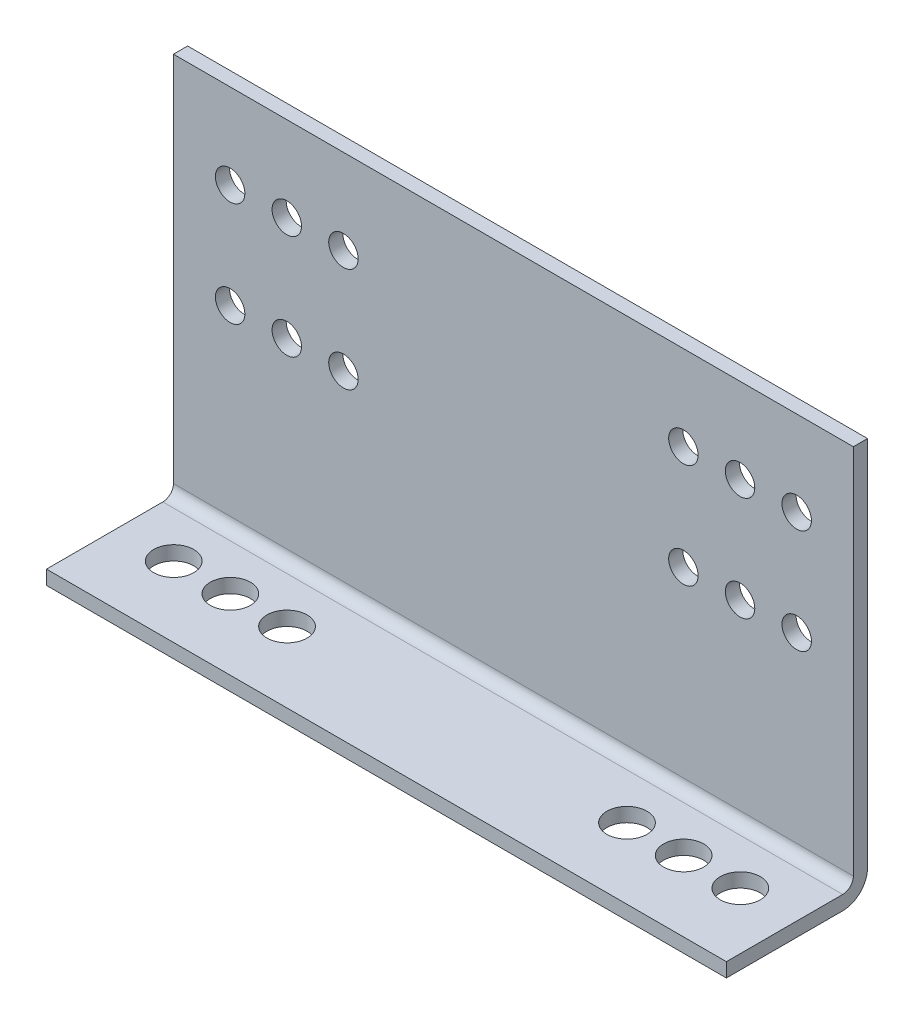
ISO-10303-21;
HEADER;
FILE_DESCRIPTION(('STEP AP214'),'2;1');
FILE_NAME('part.step','',(''),(''),'','','');
FILE_SCHEMA(('AUTOMOTIVE_DESIGN { 1 0 10303 214 1 1 1 1 }'));
ENDSEC;
DATA;
#1=APPLICATION_CONTEXT('core data for automotive mechanical design processes');
#2=APPLICATION_PROTOCOL_DEFINITION('international standard','automotive_design',2000,#1);
#3=PRODUCT_CONTEXT('',#1,'mechanical');
#4=PRODUCT('Part','Part','',(#3));
#5=PRODUCT_RELATED_PRODUCT_CATEGORY('part','',(#4));
#6=PRODUCT_DEFINITION_FORMATION('','',#4);
#7=PRODUCT_DEFINITION_CONTEXT('part definition',#1,'design');
#8=PRODUCT_DEFINITION('design','',#6,#7);
#9=PRODUCT_DEFINITION_SHAPE('','',#8);
#10=(LENGTH_UNIT() NAMED_UNIT(*) SI_UNIT(.MILLI.,.METRE.));
#11=(NAMED_UNIT(*) PLANE_ANGLE_UNIT() SI_UNIT($,.RADIAN.));
#12=(NAMED_UNIT(*) SI_UNIT($,.STERADIAN.) SOLID_ANGLE_UNIT());
#13=UNCERTAINTY_MEASURE_WITH_UNIT(LENGTH_MEASURE(1.E-05),#10,'distance_accuracy_value','');
#14=(GEOMETRIC_REPRESENTATION_CONTEXT(3) GLOBAL_UNCERTAINTY_ASSIGNED_CONTEXT((#13)) GLOBAL_UNIT_ASSIGNED_CONTEXT((#10,
#11,#12)) REPRESENTATION_CONTEXT('',''));
#15=CARTESIAN_POINT('',(0.,0.,0.));
#16=DIRECTION('',(0.,0.,1.));
#17=DIRECTION('',(1.,0.,0.));
#18=AXIS2_PLACEMENT_3D('',#15,#16,#17);
#19=CARTESIAN_POINT('',(-76.2,-41.2750000000001,28.465));
#20=DIRECTION('',(0.,1.,0.));
#21=DIRECTION('',(0.,0.,1.));
#22=AXIS2_PLACEMENT_3D('',#19,#20,#21);
#23=PLANE('',#22);
#24=CARTESIAN_POINT('',(63.5,-41.275,12.645));
#25=DIRECTION('',(0.,1.,0.));
#26=DIRECTION('',(0.,0.,1.));
#27=AXIS2_PLACEMENT_3D('',#24,#25,#26);
#28=CIRCLE('',#27,4.5);
#29=CARTESIAN_POINT('',(63.5,-41.275,17.145));
#30=VERTEX_POINT('',#29);
#31=EDGE_CURVE('E543',#30,#30,#28,.T.);
#32=ORIENTED_EDGE('',*,*,#31,.F.);
#33=EDGE_LOOP('',(#32));
#34=FACE_BOUND('',#33,.T.);
#35=CARTESIAN_POINT('',(-38.1,-41.275,12.645));
#36=DIRECTION('',(0.,1.,0.));
#37=DIRECTION('',(0.,0.,1.));
#38=AXIS2_PLACEMENT_3D('',#35,#36,#37);
#39=CIRCLE('',#38,4.5);
#40=CARTESIAN_POINT('',(-38.1,-41.2750000000001,17.145));
#41=VERTEX_POINT('',#40);
#42=EDGE_CURVE('E547',#41,#41,#39,.T.);
#43=ORIENTED_EDGE('',*,*,#42,.F.);
#44=EDGE_LOOP('',(#43));
#45=FACE_BOUND('',#44,.T.);
#46=CARTESIAN_POINT('',(38.1,-41.275,12.645));
#47=DIRECTION('',(0.,1.,0.));
#48=DIRECTION('',(0.,0.,1.));
#49=AXIS2_PLACEMENT_3D('',#46,#47,#48);
#50=CIRCLE('',#49,4.5);
#51=CARTESIAN_POINT('',(38.1,-41.275,17.145));
#52=VERTEX_POINT('',#51);
#53=EDGE_CURVE('E556',#52,#52,#50,.T.);
#54=ORIENTED_EDGE('',*,*,#53,.F.);
#55=EDGE_LOOP('',(#54));
#56=FACE_BOUND('',#55,.T.);
#57=CARTESIAN_POINT('',(-63.5,-41.275,12.645));
#58=DIRECTION('',(0.,1.,0.));
#59=DIRECTION('',(0.,0.,1.));
#60=AXIS2_PLACEMENT_3D('',#57,#58,#59);
#61=CIRCLE('',#60,4.5);
#62=CARTESIAN_POINT('',(-63.5,-41.2750000000001,17.145));
#63=VERTEX_POINT('',#62);
#64=EDGE_CURVE('E562',#63,#63,#61,.T.);
#65=ORIENTED_EDGE('',*,*,#64,.F.);
#66=EDGE_LOOP('',(#65));
#67=FACE_BOUND('',#66,.T.);
#68=DIRECTION('',(0.,0.,-1.));
#69=VECTOR('',#68,1.);
#70=CARTESIAN_POINT('',(-76.2,-41.275,0.));
#71=LINE('',#70,#69);
#72=CARTESIAN_POINT('',(-76.2,-41.275,2.38124999999999));
#73=VERTEX_POINT('',#72);
#74=CARTESIAN_POINT('',(-76.2,-41.275,28.465));
#75=VERTEX_POINT('',#74);
#76=EDGE_CURVE('E108',#73,#75,#71,.F.);
#77=ORIENTED_EDGE('',*,*,#76,.T.);
#78=DIRECTION('',(1.,0.,0.));
#79=VECTOR('',#78,1.);
#80=CARTESIAN_POINT('',(-76.2,-41.2750000000001,28.465));
#81=LINE('',#80,#79);
#82=CARTESIAN_POINT('',(76.2,-41.2750000000001,28.465));
#83=VERTEX_POINT('',#82);
#84=EDGE_CURVE('E103',#75,#83,#81,.T.);
#85=ORIENTED_EDGE('',*,*,#84,.T.);
#86=DIRECTION('',(0.,0.,1.));
#87=VECTOR('',#86,1.);
#88=CARTESIAN_POINT('',(76.2,-41.2750000000001,28.465));
#89=LINE('',#88,#87);
#90=CARTESIAN_POINT('',(76.2,-41.275,2.38124999999999));
#91=VERTEX_POINT('',#90);
#92=EDGE_CURVE('E97',#83,#91,#89,.F.);
#93=ORIENTED_EDGE('',*,*,#92,.T.);
#94=DIRECTION('',(1.,0.,0.));
#95=VECTOR('',#94,1.);
#96=CARTESIAN_POINT('',(76.2000000000001,-41.275,2.38125));
#97=LINE('',#96,#95);
#98=EDGE_CURVE('E100',#91,#73,#97,.F.);
#99=ORIENTED_EDGE('',*,*,#98,.T.);
#100=EDGE_LOOP('',(#77,#85,#93,#99));
#101=FACE_BOUND('',#100,.T.);
#102=CARTESIAN_POINT('',(50.8,-41.275,12.645));
#103=DIRECTION('',(0.,1.,0.));
#104=DIRECTION('',(0.,0.,1.));
#105=AXIS2_PLACEMENT_3D('',#102,#103,#104);
#106=CIRCLE('',#105,4.49999999999999);
#107=CARTESIAN_POINT('',(50.8,-41.275,17.145));
#108=VERTEX_POINT('',#107);
#109=EDGE_CURVE('E131',#108,#108,#106,.F.);
#110=ORIENTED_EDGE('',*,*,#109,.T.);
#111=EDGE_LOOP('',(#110));
#112=FACE_BOUND('',#111,.T.);
#113=CARTESIAN_POINT('',(-50.8,-41.275,12.645));
#114=DIRECTION('',(0.,1.,0.));
#115=DIRECTION('',(0.,0.,1.));
#116=AXIS2_PLACEMENT_3D('',#113,#114,#115);
#117=CIRCLE('',#116,4.49999999999999);
#118=CARTESIAN_POINT('',(-50.8,-41.275,17.145));
#119=VERTEX_POINT('',#118);
#120=EDGE_CURVE('E38',#119,#119,#117,.F.);
#121=ORIENTED_EDGE('',*,*,#120,.T.);
#122=EDGE_LOOP('',(#121));
#123=FACE_BOUND('',#122,.T.);
#124=ADVANCED_FACE('F35',(#34,#45,#56,#67,#101,#112,#123),#23,.T.);
#125=CARTESIAN_POINT('',(-50.8,-41.275,12.645));
#126=DIRECTION('',(0.,1.,0.));
#127=DIRECTION('',(0.,0.,1.));
#128=AXIS2_PLACEMENT_3D('',#125,#126,#127);
#129=CYLINDRICAL_SURFACE('',#128,4.49999999999999);
#130=CARTESIAN_POINT('',(-50.8,-44.4500000000002,12.645));
#131=DIRECTION('',(0.,1.,0.));
#132=DIRECTION('',(0.,0.,1.));
#133=AXIS2_PLACEMENT_3D('',#130,#131,#132);
#134=CIRCLE('',#133,4.49999999999999);
#135=CARTESIAN_POINT('',(-50.8,-44.4500000000002,17.145));
#136=VERTEX_POINT('',#135);
#137=EDGE_CURVE('E125',#136,#136,#134,.F.);
#138=ORIENTED_EDGE('',*,*,#137,.T.);
#139=EDGE_LOOP('',(#138));
#140=FACE_BOUND('',#139,.T.);
#141=ORIENTED_EDGE('',*,*,#120,.F.);
#142=EDGE_LOOP('',(#141));
#143=FACE_BOUND('',#142,.T.);
#144=ADVANCED_FACE('F249',(#140,#143),#129,.F.);
#145=CARTESIAN_POINT('',(50.8,-41.275,12.645));
#146=DIRECTION('',(0.,1.,0.));
#147=DIRECTION('',(0.,0.,1.));
#148=AXIS2_PLACEMENT_3D('',#145,#146,#147);
#149=CYLINDRICAL_SURFACE('',#148,4.49999999999999);
#150=CARTESIAN_POINT('',(50.8,-44.4500000000002,12.645));
#151=DIRECTION('',(0.,1.,0.));
#152=DIRECTION('',(0.,0.,1.));
#153=AXIS2_PLACEMENT_3D('',#150,#151,#152);
#154=CIRCLE('',#153,4.49999999999999);
#155=CARTESIAN_POINT('',(50.8,-44.4500000000002,17.145));
#156=VERTEX_POINT('',#155);
#157=EDGE_CURVE('E128',#156,#156,#154,.F.);
#158=ORIENTED_EDGE('',*,*,#157,.T.);
#159=EDGE_LOOP('',(#158));
#160=FACE_BOUND('',#159,.T.);
#161=ORIENTED_EDGE('',*,*,#109,.F.);
#162=EDGE_LOOP('',(#161));
#163=FACE_BOUND('',#162,.T.);
#164=ADVANCED_FACE('F238',(#160,#163),#149,.F.);
#165=CARTESIAN_POINT('',(-76.2,-44.4500000000001,28.465));
#166=DIRECTION('',(0.,0.,-1.));
#167=DIRECTION('',(0.,1.,0.));
#168=AXIS2_PLACEMENT_3D('',#165,#166,#167);
#169=PLANE('',#168);
#170=DIRECTION('',(0.,1.,0.));
#171=VECTOR('',#170,1.);
#172=CARTESIAN_POINT('',(-76.2,-44.45,28.465));
#173=LINE('',#172,#171);
#174=CARTESIAN_POINT('',(-76.2,-44.4500000000001,28.465));
#175=VERTEX_POINT('',#174);
#176=EDGE_CURVE('E119',#75,#175,#173,.F.);
#177=ORIENTED_EDGE('',*,*,#176,.T.);
#178=DIRECTION('',(1.,0.,0.));
#179=VECTOR('',#178,1.);
#180=CARTESIAN_POINT('',(-76.2,-44.4500000000001,28.465));
#181=LINE('',#180,#179);
#182=CARTESIAN_POINT('',(76.2,-44.4500000000001,28.465));
#183=VERTEX_POINT('',#182);
#184=EDGE_CURVE('E174',#175,#183,#181,.T.);
#185=ORIENTED_EDGE('',*,*,#184,.T.);
#186=DIRECTION('',(0.,1.,0.));
#187=VECTOR('',#186,1.);
#188=CARTESIAN_POINT('',(76.2,-44.4500000000001,28.465));
#189=LINE('',#188,#187);
#190=EDGE_CURVE('E109',#183,#83,#189,.T.);
#191=ORIENTED_EDGE('',*,*,#190,.T.);
#192=ORIENTED_EDGE('',*,*,#84,.F.);
#193=EDGE_LOOP('',(#177,#185,#191,#192));
#194=FACE_BOUND('',#193,.T.);
#195=ADVANCED_FACE('F256',(#194),#169,.F.);
#196=CARTESIAN_POINT('',(76.2000000000001,-38.89375,2.38125));
#197=DIRECTION('',(1.,0.,0.));
#198=DIRECTION('',(0.,0.,-1.));
#199=AXIS2_PLACEMENT_3D('',#196,#197,#198);
#200=CYLINDRICAL_SURFACE('',#199,2.38125000000002);
#201=CARTESIAN_POINT('',(-76.2,-38.89375,2.38125));
#202=DIRECTION('',(1.,0.,0.));
#203=DIRECTION('',(0.,0.,-1.));
#204=AXIS2_PLACEMENT_3D('',#201,#202,#203);
#205=CIRCLE('',#204,2.38125000000002);
#206=CARTESIAN_POINT('',(-76.2,-38.89375,0.));
#207=VERTEX_POINT('',#206);
#208=EDGE_CURVE('E118',#73,#207,#205,.T.);
#209=ORIENTED_EDGE('',*,*,#208,.F.);
#210=ORIENTED_EDGE('',*,*,#98,.F.);
#211=CARTESIAN_POINT('',(76.2,-38.89375,2.38125));
#212=DIRECTION('',(1.,0.,0.));
#213=DIRECTION('',(0.,0.,-1.));
#214=AXIS2_PLACEMENT_3D('',#211,#212,#213);
#215=CIRCLE('',#214,2.38125000000002);
#216=CARTESIAN_POINT('',(76.2,-38.89375,0.));
#217=VERTEX_POINT('',#216);
#218=EDGE_CURVE('E115',#91,#217,#215,.T.);
#219=ORIENTED_EDGE('',*,*,#218,.T.);
#220=DIRECTION('',(-1.,0.,0.));
#221=VECTOR('',#220,1.);
#222=CARTESIAN_POINT('',(-76.2,-38.89375,0.));
#223=LINE('',#222,#221);
#224=EDGE_CURVE('E164',#217,#207,#223,.T.);
#225=ORIENTED_EDGE('',*,*,#224,.T.);
#226=EDGE_LOOP('',(#209,#210,#219,#225));
#227=FACE_BOUND('',#226,.T.);
#228=ADVANCED_FACE('F114',(#227),#200,.F.);
#229=CARTESIAN_POINT('',(-76.2,-44.4500000000001,28.465));
#230=DIRECTION('',(0.,1.,0.));
#231=DIRECTION('',(0.,0.,1.));
#232=AXIS2_PLACEMENT_3D('',#229,#230,#231);
#233=PLANE('',#232);
#234=CARTESIAN_POINT('',(63.5,-44.45,12.6449999999999));
#235=DIRECTION('',(0.,1.,0.));
#236=DIRECTION('',(0.,0.,1.));
#237=AXIS2_PLACEMENT_3D('',#234,#235,#236);
#238=CIRCLE('',#237,4.5);
#239=CARTESIAN_POINT('',(63.5,-44.45,17.145));
#240=VERTEX_POINT('',#239);
#241=EDGE_CURVE('E546',#240,#240,#238,.F.);
#242=ORIENTED_EDGE('',*,*,#241,.F.);
#243=EDGE_LOOP('',(#242));
#244=FACE_BOUND('',#243,.T.);
#245=CARTESIAN_POINT('',(-38.1,-44.45,12.645));
#246=DIRECTION('',(0.,1.,0.));
#247=DIRECTION('',(0.,0.,1.));
#248=AXIS2_PLACEMENT_3D('',#245,#246,#247);
#249=CIRCLE('',#248,4.5);
#250=CARTESIAN_POINT('',(-38.1,-44.4500000000001,17.145));
#251=VERTEX_POINT('',#250);
#252=EDGE_CURVE('E550',#251,#251,#249,.F.);
#253=ORIENTED_EDGE('',*,*,#252,.F.);
#254=EDGE_LOOP('',(#253));
#255=FACE_BOUND('',#254,.T.);
#256=CARTESIAN_POINT('',(38.1,-44.45,12.6449999999999));
#257=DIRECTION('',(0.,1.,0.));
#258=DIRECTION('',(0.,0.,1.));
#259=AXIS2_PLACEMENT_3D('',#256,#257,#258);
#260=CIRCLE('',#259,4.5);
#261=CARTESIAN_POINT('',(38.1,-44.45,17.1449999999999));
#262=VERTEX_POINT('',#261);
#263=EDGE_CURVE('E559',#262,#262,#260,.F.);
#264=ORIENTED_EDGE('',*,*,#263,.F.);
#265=EDGE_LOOP('',(#264));
#266=FACE_BOUND('',#265,.T.);
#267=CARTESIAN_POINT('',(-63.5,-44.45,12.645));
#268=DIRECTION('',(0.,1.,0.));
#269=DIRECTION('',(0.,0.,1.));
#270=AXIS2_PLACEMENT_3D('',#267,#268,#269);
#271=CIRCLE('',#270,4.5);
#272=CARTESIAN_POINT('',(-63.5,-44.4500000000001,17.145));
#273=VERTEX_POINT('',#272);
#274=EDGE_CURVE('E565',#273,#273,#271,.F.);
#275=ORIENTED_EDGE('',*,*,#274,.F.);
#276=EDGE_LOOP('',(#275));
#277=FACE_BOUND('',#276,.T.);
#278=DIRECTION('',(0.,0.,1.));
#279=VECTOR('',#278,1.);
#280=CARTESIAN_POINT('',(76.2,-44.4500000000001,28.465));
#281=LINE('',#280,#279);
#282=CARTESIAN_POINT('',(76.2,-44.45,2.38124999999998));
#283=VERTEX_POINT('',#282);
#284=EDGE_CURVE('E177',#183,#283,#281,.F.);
#285=ORIENTED_EDGE('',*,*,#284,.F.);
#286=ORIENTED_EDGE('',*,*,#184,.F.);
#287=DIRECTION('',(0.,0.,1.));
#288=VECTOR('',#287,1.);
#289=CARTESIAN_POINT('',(-76.2,-44.4500000000001,28.465));
#290=LINE('',#289,#288);
#291=CARTESIAN_POINT('',(-76.2,-44.45,2.38124999999998));
#292=VERTEX_POINT('',#291);
#293=EDGE_CURVE('E171',#292,#175,#290,.T.);
#294=ORIENTED_EDGE('',*,*,#293,.F.);
#295=DIRECTION('',(1.,0.,0.));
#296=VECTOR('',#295,1.);
#297=CARTESIAN_POINT('',(76.2000000000001,-44.45,2.38124999999998));
#298=LINE('',#297,#296);
#299=EDGE_CURVE('E167',#283,#292,#298,.F.);
#300=ORIENTED_EDGE('',*,*,#299,.F.);
#301=EDGE_LOOP('',(#285,#286,#294,#300));
#302=FACE_BOUND('',#301,.T.);
#303=ORIENTED_EDGE('',*,*,#157,.F.);
#304=EDGE_LOOP('',(#303));
#305=FACE_BOUND('',#304,.T.);
#306=ORIENTED_EDGE('',*,*,#137,.F.);
#307=EDGE_LOOP('',(#306));
#308=FACE_BOUND('',#307,.T.);
#309=ADVANCED_FACE('F241',(#244,#255,#266,#277,#302,#305,#308),#233,.F.);
#310=CARTESIAN_POINT('',(-76.2,-44.45,0.));
#311=DIRECTION('',(0.,0.,-1.));
#312=DIRECTION('',(-1.,0.,0.));
#313=AXIS2_PLACEMENT_3D('',#310,#311,#312);
#314=PLANE('',#313);
#315=CARTESIAN_POINT('',(-63.5,1.99999999999993,0.));
#316=DIRECTION('',(0.,0.,1.));
#317=DIRECTION('',(1.,0.,0.));
#318=AXIS2_PLACEMENT_3D('',#315,#316,#317);
#319=CIRCLE('',#318,3.29999999999999);
#320=CARTESIAN_POINT('',(-60.2,1.99999999999993,0.));
#321=VERTEX_POINT('',#320);
#322=EDGE_CURVE('E569',#321,#321,#319,.T.);
#323=ORIENTED_EDGE('',*,*,#322,.F.);
#324=EDGE_LOOP('',(#323));
#325=FACE_BOUND('',#324,.T.);
#326=CARTESIAN_POINT('',(-63.5,25.3999999999999,0.));
#327=DIRECTION('',(0.,0.,1.));
#328=DIRECTION('',(1.,0.,0.));
#329=AXIS2_PLACEMENT_3D('',#326,#327,#328);
#330=CIRCLE('',#329,3.29999999999999);
#331=CARTESIAN_POINT('',(-60.2,25.3999999999999,0.));
#332=VERTEX_POINT('',#331);
#333=EDGE_CURVE('E574',#332,#332,#330,.T.);
#334=ORIENTED_EDGE('',*,*,#333,.F.);
#335=EDGE_LOOP('',(#334));
#336=FACE_BOUND('',#335,.T.);
#337=CARTESIAN_POINT('',(38.1,25.3999999999999,0.));
#338=DIRECTION('',(0.,0.,1.));
#339=DIRECTION('',(1.,0.,0.));
#340=AXIS2_PLACEMENT_3D('',#337,#338,#339);
#341=CIRCLE('',#340,3.29999999999999);
#342=CARTESIAN_POINT('',(41.4,25.3999999999999,0.));
#343=VERTEX_POINT('',#342);
#344=EDGE_CURVE('E580',#343,#343,#341,.T.);
#345=ORIENTED_EDGE('',*,*,#344,.F.);
#346=EDGE_LOOP('',(#345));
#347=FACE_BOUND('',#346,.T.);
#348=CARTESIAN_POINT('',(38.1,1.99999999999993,0.));
#349=DIRECTION('',(0.,0.,1.));
#350=DIRECTION('',(1.,0.,0.));
#351=AXIS2_PLACEMENT_3D('',#348,#349,#350);
#352=CIRCLE('',#351,3.29999999999999);
#353=CARTESIAN_POINT('',(41.4,1.99999999999993,0.));
#354=VERTEX_POINT('',#353);
#355=EDGE_CURVE('E586',#354,#354,#352,.T.);
#356=ORIENTED_EDGE('',*,*,#355,.F.);
#357=EDGE_LOOP('',(#356));
#358=FACE_BOUND('',#357,.T.);
#359=CARTESIAN_POINT('',(63.5,25.3999999999999,0.));
#360=DIRECTION('',(0.,0.,1.));
#361=DIRECTION('',(1.,0.,0.));
#362=AXIS2_PLACEMENT_3D('',#359,#360,#361);
#363=CIRCLE('',#362,3.3);
#364=CARTESIAN_POINT('',(66.8,25.3999999999999,0.));
#365=VERTEX_POINT('',#364);
#366=EDGE_CURVE('E592',#365,#365,#363,.T.);
#367=ORIENTED_EDGE('',*,*,#366,.F.);
#368=EDGE_LOOP('',(#367));
#369=FACE_BOUND('',#368,.T.);
#370=CARTESIAN_POINT('',(63.5,1.99999999999993,0.));
#371=DIRECTION('',(0.,0.,1.));
#372=DIRECTION('',(1.,0.,0.));
#373=AXIS2_PLACEMENT_3D('',#370,#371,#372);
#374=CIRCLE('',#373,3.3);
#375=CARTESIAN_POINT('',(66.8,1.99999999999993,0.));
#376=VERTEX_POINT('',#375);
#377=EDGE_CURVE('E598',#376,#376,#374,.T.);
#378=ORIENTED_EDGE('',*,*,#377,.F.);
#379=EDGE_LOOP('',(#378));
#380=FACE_BOUND('',#379,.T.);
#381=CARTESIAN_POINT('',(-38.1,1.99999999999993,0.));
#382=DIRECTION('',(0.,0.,1.));
#383=DIRECTION('',(1.,0.,0.));
#384=AXIS2_PLACEMENT_3D('',#381,#382,#383);
#385=CIRCLE('',#384,3.29999999999999);
#386=CARTESIAN_POINT('',(-34.8,1.99999999999993,0.));
#387=VERTEX_POINT('',#386);
#388=EDGE_CURVE('E145',#387,#387,#385,.T.);
#389=ORIENTED_EDGE('',*,*,#388,.F.);
#390=EDGE_LOOP('',(#389));
#391=FACE_BOUND('',#390,.T.);
#392=CARTESIAN_POINT('',(-38.1,25.3999999999999,0.));
#393=DIRECTION('',(0.,0.,1.));
#394=DIRECTION('',(1.,0.,0.));
#395=AXIS2_PLACEMENT_3D('',#392,#393,#394);
#396=CIRCLE('',#395,3.29999999999999);
#397=CARTESIAN_POINT('',(-34.8,25.3999999999999,0.));
#398=VERTEX_POINT('',#397);
#399=EDGE_CURVE('E136',#398,#398,#396,.T.);
#400=ORIENTED_EDGE('',*,*,#399,.F.);
#401=EDGE_LOOP('',(#400));
#402=FACE_BOUND('',#401,.T.);
#403=CARTESIAN_POINT('',(-50.8,25.3999999999999,0.));
#404=DIRECTION('',(0.,0.,1.));
#405=DIRECTION('',(1.,0.,0.));
#406=AXIS2_PLACEMENT_3D('',#403,#404,#405);
#407=CIRCLE('',#406,3.29999999999999);
#408=CARTESIAN_POINT('',(-47.5,25.3999999999999,0.));
#409=VERTEX_POINT('',#408);
#410=EDGE_CURVE('E166',#409,#409,#407,.F.);
#411=ORIENTED_EDGE('',*,*,#410,.T.);
#412=EDGE_LOOP('',(#411));
#413=FACE_BOUND('',#412,.T.);
#414=CARTESIAN_POINT('',(50.8,25.3999999999999,0.));
#415=DIRECTION('',(0.,0.,1.));
#416=DIRECTION('',(1.,0.,0.));
#417=AXIS2_PLACEMENT_3D('',#414,#415,#416);
#418=CIRCLE('',#417,3.29999999999999);
#419=CARTESIAN_POINT('',(54.1,25.3999999999999,0.));
#420=VERTEX_POINT('',#419);
#421=EDGE_CURVE('E230',#420,#420,#418,.F.);
#422=ORIENTED_EDGE('',*,*,#421,.T.);
#423=EDGE_LOOP('',(#422));
#424=FACE_BOUND('',#423,.T.);
#425=CARTESIAN_POINT('',(-50.8,1.99999999999993,0.));
#426=DIRECTION('',(0.,0.,1.));
#427=DIRECTION('',(1.,0.,0.));
#428=AXIS2_PLACEMENT_3D('',#425,#426,#427);
#429=CIRCLE('',#428,3.29999999999999);
#430=CARTESIAN_POINT('',(-47.5,1.99999999999993,0.));
#431=VERTEX_POINT('',#430);
#432=EDGE_CURVE('E227',#431,#431,#429,.F.);
#433=ORIENTED_EDGE('',*,*,#432,.T.);
#434=EDGE_LOOP('',(#433));
#435=FACE_BOUND('',#434,.T.);
#436=CARTESIAN_POINT('',(50.8,1.99999999999993,0.));
#437=DIRECTION('',(0.,0.,1.));
#438=DIRECTION('',(1.,0.,0.));
#439=AXIS2_PLACEMENT_3D('',#436,#437,#438);
#440=CIRCLE('',#439,3.29999999999999);
#441=CARTESIAN_POINT('',(54.1,1.99999999999993,0.));
#442=VERTEX_POINT('',#441);
#443=EDGE_CURVE('E185',#442,#442,#440,.F.);
#444=ORIENTED_EDGE('',*,*,#443,.T.);
#445=EDGE_LOOP('',(#444));
#446=FACE_BOUND('',#445,.T.);
#447=DIRECTION('',(0.,1.,0.));
#448=VECTOR('',#447,1.);
#449=CARTESIAN_POINT('',(76.2,44.45,0.));
#450=LINE('',#449,#448);
#451=CARTESIAN_POINT('',(76.2,44.45,0.));
#452=VERTEX_POINT('',#451);
#453=EDGE_CURVE('E124',#452,#217,#450,.F.);
#454=ORIENTED_EDGE('',*,*,#453,.F.);
#455=DIRECTION('',(-1.,0.,0.));
#456=VECTOR('',#455,1.);
#457=CARTESIAN_POINT('',(76.2,44.45,0.));
#458=LINE('',#457,#456);
#459=CARTESIAN_POINT('',(-76.2,44.45,0.));
#460=VERTEX_POINT('',#459);
#461=EDGE_CURVE('E162',#460,#452,#458,.F.);
#462=ORIENTED_EDGE('',*,*,#461,.F.);
#463=DIRECTION('',(0.,-1.,0.));
#464=VECTOR('',#463,1.);
#465=CARTESIAN_POINT('',(-76.2,44.45,0.));
#466=LINE('',#465,#464);
#467=EDGE_CURVE('E160',#207,#460,#466,.F.);
#468=ORIENTED_EDGE('',*,*,#467,.F.);
#469=ORIENTED_EDGE('',*,*,#224,.F.);
#470=EDGE_LOOP('',(#454,#462,#468,#469));
#471=FACE_BOUND('',#470,.T.);
#472=ADVANCED_FACE('F244',(#325,#336,#347,#358,#369,#380,#391,#402,#413,#424,#435,#446,#471),
#314,.F.);
#473=CARTESIAN_POINT('',(-50.8,25.3999999999999,0.));
#474=DIRECTION('',(0.,0.,1.));
#475=DIRECTION('',(1.,0.,0.));
#476=AXIS2_PLACEMENT_3D('',#473,#474,#475);
#477=CYLINDRICAL_SURFACE('',#476,3.29999999999999);
#478=ORIENTED_EDGE('',*,*,#410,.F.);
#479=EDGE_LOOP('',(#478));
#480=FACE_BOUND('',#479,.T.);
#481=CARTESIAN_POINT('',(-50.8,25.3999999999999,-3.175));
#482=DIRECTION('',(0.,0.,1.));
#483=DIRECTION('',(1.,0.,0.));
#484=AXIS2_PLACEMENT_3D('',#481,#482,#483);
#485=CIRCLE('',#484,3.29999999999999);
#486=CARTESIAN_POINT('',(-47.5,25.3999999999999,-3.175));
#487=VERTEX_POINT('',#486);
#488=EDGE_CURVE('E152',#487,#487,#485,.T.);
#489=ORIENTED_EDGE('',*,*,#488,.F.);
#490=EDGE_LOOP('',(#489));
#491=FACE_BOUND('',#490,.T.);
#492=ADVANCED_FACE('F301',(#480,#491),#477,.F.);
#493=CARTESIAN_POINT('',(50.8,25.3999999999999,0.));
#494=DIRECTION('',(0.,0.,1.));
#495=DIRECTION('',(1.,0.,0.));
#496=AXIS2_PLACEMENT_3D('',#493,#494,#495);
#497=CYLINDRICAL_SURFACE('',#496,3.29999999999999);
#498=ORIENTED_EDGE('',*,*,#421,.F.);
#499=EDGE_LOOP('',(#498));
#500=FACE_BOUND('',#499,.T.);
#501=CARTESIAN_POINT('',(50.8,25.3999999999999,-3.175));
#502=DIRECTION('',(0.,0.,1.));
#503=DIRECTION('',(1.,0.,0.));
#504=AXIS2_PLACEMENT_3D('',#501,#502,#503);
#505=CIRCLE('',#504,3.29999999999999);
#506=CARTESIAN_POINT('',(54.1,25.3999999999999,-3.175));
#507=VERTEX_POINT('',#506);
#508=EDGE_CURVE('E217',#507,#507,#505,.T.);
#509=ORIENTED_EDGE('',*,*,#508,.F.);
#510=EDGE_LOOP('',(#509));
#511=FACE_BOUND('',#510,.T.);
#512=ADVANCED_FACE('F297',(#500,#511),#497,.F.);
#513=CARTESIAN_POINT('',(-50.8,1.99999999999993,0.));
#514=DIRECTION('',(0.,0.,1.));
#515=DIRECTION('',(1.,0.,0.));
#516=AXIS2_PLACEMENT_3D('',#513,#514,#515);
#517=CYLINDRICAL_SURFACE('',#516,3.29999999999999);
#518=ORIENTED_EDGE('',*,*,#432,.F.);
#519=EDGE_LOOP('',(#518));
#520=FACE_BOUND('',#519,.T.);
#521=CARTESIAN_POINT('',(-50.8,1.99999999999993,-3.175));
#522=DIRECTION('',(0.,0.,1.));
#523=DIRECTION('',(1.,0.,0.));
#524=AXIS2_PLACEMENT_3D('',#521,#522,#523);
#525=CIRCLE('',#524,3.29999999999999);
#526=CARTESIAN_POINT('',(-47.5,1.99999999999993,-3.175));
#527=VERTEX_POINT('',#526);
#528=EDGE_CURVE('E214',#527,#527,#525,.T.);
#529=ORIENTED_EDGE('',*,*,#528,.F.);
#530=EDGE_LOOP('',(#529));
#531=FACE_BOUND('',#530,.T.);
#532=ADVANCED_FACE('F293',(#520,#531),#517,.F.);
#533=CARTESIAN_POINT('',(50.8,1.99999999999993,0.));
#534=DIRECTION('',(0.,0.,1.));
#535=DIRECTION('',(1.,0.,0.));
#536=AXIS2_PLACEMENT_3D('',#533,#534,#535);
#537=CYLINDRICAL_SURFACE('',#536,3.29999999999999);
#538=ORIENTED_EDGE('',*,*,#443,.F.);
#539=EDGE_LOOP('',(#538));
#540=FACE_BOUND('',#539,.T.);
#541=CARTESIAN_POINT('',(50.8,1.99999999999993,-3.175));
#542=DIRECTION('',(0.,0.,1.));
#543=DIRECTION('',(1.,0.,0.));
#544=AXIS2_PLACEMENT_3D('',#541,#542,#543);
#545=CIRCLE('',#544,3.29999999999999);
#546=CARTESIAN_POINT('',(54.1,1.99999999999993,-3.175));
#547=VERTEX_POINT('',#546);
#548=EDGE_CURVE('E183',#547,#547,#545,.T.);
#549=ORIENTED_EDGE('',*,*,#548,.F.);
#550=EDGE_LOOP('',(#549));
#551=FACE_BOUND('',#550,.T.);
#552=ADVANCED_FACE('F290',(#540,#551),#537,.F.);
#553=CARTESIAN_POINT('',(76.2,44.45,-3.175));
#554=DIRECTION('',(1.,0.,0.));
#555=DIRECTION('',(0.,1.,0.));
#556=AXIS2_PLACEMENT_3D('',#553,#554,#555);
#557=PLANE('',#556);
#558=DIRECTION('',(0.,1.,0.));
#559=VECTOR('',#558,1.);
#560=CARTESIAN_POINT('',(76.2,-44.45,-3.175));
#561=LINE('',#560,#559);
#562=CARTESIAN_POINT('',(76.2,44.45,-3.17500000000001));
#563=VERTEX_POINT('',#562);
#564=CARTESIAN_POINT('',(76.2,-38.89375,-3.175));
#565=VERTEX_POINT('',#564);
#566=EDGE_CURVE('E159',#563,#565,#561,.F.);
#567=ORIENTED_EDGE('',*,*,#566,.F.);
#568=DIRECTION('',(0.,0.,1.));
#569=VECTOR('',#568,1.);
#570=CARTESIAN_POINT('',(76.2,44.45,-3.175));
#571=LINE('',#570,#569);
#572=EDGE_CURVE('E153',#452,#563,#571,.F.);
#573=ORIENTED_EDGE('',*,*,#572,.F.);
#574=ORIENTED_EDGE('',*,*,#453,.T.);
#575=ORIENTED_EDGE('',*,*,#218,.F.);
#576=ORIENTED_EDGE('',*,*,#92,.F.);
#577=ORIENTED_EDGE('',*,*,#190,.F.);
#578=ORIENTED_EDGE('',*,*,#284,.T.);
#579=CARTESIAN_POINT('',(76.2,-38.89375,2.38125));
#580=DIRECTION('',(1.,0.,0.));
#581=DIRECTION('',(0.,0.,-1.));
#582=AXIS2_PLACEMENT_3D('',#579,#580,#581);
#583=CIRCLE('',#582,5.55625000000001);
#584=EDGE_CURVE('E170',#565,#283,#583,.F.);
#585=ORIENTED_EDGE('',*,*,#584,.F.);
#586=EDGE_LOOP('',(#567,#573,#574,#575,#576,#577,#578,#585));
#587=FACE_BOUND('',#586,.T.);
#588=ADVANCED_FACE('F122',(#587),#557,.T.);
#589=CARTESIAN_POINT('',(76.2000000000001,-38.89375,2.38125));
#590=DIRECTION('',(1.,0.,0.));
#591=DIRECTION('',(0.,0.,-1.));
#592=AXIS2_PLACEMENT_3D('',#589,#590,#591);
#593=CYLINDRICAL_SURFACE('',#592,5.55625000000001);
#594=ORIENTED_EDGE('',*,*,#299,.T.);
#595=CARTESIAN_POINT('',(-76.2,-38.89375,2.38125));
#596=DIRECTION('',(1.,0.,0.));
#597=DIRECTION('',(0.,0.,-1.));
#598=AXIS2_PLACEMENT_3D('',#595,#596,#597);
#599=CIRCLE('',#598,5.55625000000001);
#600=CARTESIAN_POINT('',(-76.2,-38.89375,-3.175));
#601=VERTEX_POINT('',#600);
#602=EDGE_CURVE('E163',#292,#601,#599,.T.);
#603=ORIENTED_EDGE('',*,*,#602,.T.);
#604=DIRECTION('',(-1.,0.,0.));
#605=VECTOR('',#604,1.);
#606=CARTESIAN_POINT('',(-76.2,-38.89375,-3.175));
#607=LINE('',#606,#605);
#608=EDGE_CURVE('E156',#565,#601,#607,.T.);
#609=ORIENTED_EDGE('',*,*,#608,.F.);
#610=ORIENTED_EDGE('',*,*,#584,.T.);
#611=EDGE_LOOP('',(#594,#603,#609,#610));
#612=FACE_BOUND('',#611,.T.);
#613=ADVANCED_FACE('F284',(#612),#593,.T.);
#614=CARTESIAN_POINT('',(-76.2,44.45,-3.175));
#615=DIRECTION('',(-1.,0.,0.));
#616=DIRECTION('',(0.,-1.,0.));
#617=AXIS2_PLACEMENT_3D('',#614,#615,#616);
#618=PLANE('',#617);
#619=DIRECTION('',(0.,0.,1.));
#620=VECTOR('',#619,1.);
#621=CARTESIAN_POINT('',(-76.2,44.45,-3.175));
#622=LINE('',#621,#620);
#623=CARTESIAN_POINT('',(-76.2,44.45,-3.175));
#624=VERTEX_POINT('',#623);
#625=EDGE_CURVE('E53',#624,#460,#622,.T.);
#626=ORIENTED_EDGE('',*,*,#625,.F.);
#627=DIRECTION('',(0.,1.,0.));
#628=VECTOR('',#627,1.);
#629=CARTESIAN_POINT('',(-76.2,-44.45,-3.175));
#630=LINE('',#629,#628);
#631=EDGE_CURVE('E44',#601,#624,#630,.T.);
#632=ORIENTED_EDGE('',*,*,#631,.F.);
#633=ORIENTED_EDGE('',*,*,#602,.F.);
#634=ORIENTED_EDGE('',*,*,#293,.T.);
#635=ORIENTED_EDGE('',*,*,#176,.F.);
#636=ORIENTED_EDGE('',*,*,#76,.F.);
#637=ORIENTED_EDGE('',*,*,#208,.T.);
#638=ORIENTED_EDGE('',*,*,#467,.T.);
#639=EDGE_LOOP('',(#626,#632,#633,#634,#635,#636,#637,#638));
#640=FACE_BOUND('',#639,.T.);
#641=ADVANCED_FACE('F275',(#640),#618,.T.);
#642=CARTESIAN_POINT('',(76.2,44.45,-3.175));
#643=DIRECTION('',(0.,1.,0.));
#644=DIRECTION('',(-1.,0.,0.));
#645=AXIS2_PLACEMENT_3D('',#642,#643,#644);
#646=PLANE('',#645);
#647=DIRECTION('',(-1.,0.,0.));
#648=VECTOR('',#647,1.);
#649=CARTESIAN_POINT('',(-76.2,44.45,-3.175));
#650=LINE('',#649,#648);
#651=EDGE_CURVE('E11',#624,#563,#650,.F.);
#652=ORIENTED_EDGE('',*,*,#651,.F.);
#653=ORIENTED_EDGE('',*,*,#625,.T.);
#654=ORIENTED_EDGE('',*,*,#461,.T.);
#655=ORIENTED_EDGE('',*,*,#572,.T.);
#656=EDGE_LOOP('',(#652,#653,#654,#655));
#657=FACE_BOUND('',#656,.T.);
#658=ADVANCED_FACE('F263',(#657),#646,.T.);
#659=CARTESIAN_POINT('',(-76.2,-44.45,-3.175));
#660=DIRECTION('',(0.,0.,-1.));
#661=DIRECTION('',(-1.,0.,0.));
#662=AXIS2_PLACEMENT_3D('',#659,#660,#661);
#663=PLANE('',#662);
#664=CARTESIAN_POINT('',(-63.5,1.99999999999993,-3.175));
#665=DIRECTION('',(0.,0.,-1.));
#666=DIRECTION('',(-1.,0.,0.));
#667=AXIS2_PLACEMENT_3D('',#664,#665,#666);
#668=CIRCLE('',#667,3.29999999999999);
#669=CARTESIAN_POINT('',(-66.8,1.99999999999993,-3.175));
#670=VERTEX_POINT('',#669);
#671=EDGE_CURVE('E568',#670,#670,#668,.F.);
#672=ORIENTED_EDGE('',*,*,#671,.T.);
#673=EDGE_LOOP('',(#672));
#674=FACE_BOUND('',#673,.T.);
#675=CARTESIAN_POINT('',(-63.5,25.3999999999999,-3.175));
#676=DIRECTION('',(0.,0.,-1.));
#677=DIRECTION('',(-1.,0.,0.));
#678=AXIS2_PLACEMENT_3D('',#675,#676,#677);
#679=CIRCLE('',#678,3.29999999999999);
#680=CARTESIAN_POINT('',(-66.8,25.3999999999999,-3.175));
#681=VERTEX_POINT('',#680);
#682=EDGE_CURVE('E572',#681,#681,#679,.F.);
#683=ORIENTED_EDGE('',*,*,#682,.T.);
#684=EDGE_LOOP('',(#683));
#685=FACE_BOUND('',#684,.T.);
#686=CARTESIAN_POINT('',(38.1,25.3999999999999,-3.175));
#687=DIRECTION('',(0.,0.,-1.));
#688=DIRECTION('',(-1.,0.,0.));
#689=AXIS2_PLACEMENT_3D('',#686,#687,#688);
#690=CIRCLE('',#689,3.29999999999999);
#691=CARTESIAN_POINT('',(34.8,25.3999999999999,-3.175));
#692=VERTEX_POINT('',#691);
#693=EDGE_CURVE('E577',#692,#692,#690,.F.);
#694=ORIENTED_EDGE('',*,*,#693,.T.);
#695=EDGE_LOOP('',(#694));
#696=FACE_BOUND('',#695,.T.);
#697=CARTESIAN_POINT('',(38.1,1.99999999999993,-3.175));
#698=DIRECTION('',(0.,0.,-1.));
#699=DIRECTION('',(-1.,0.,0.));
#700=AXIS2_PLACEMENT_3D('',#697,#698,#699);
#701=CIRCLE('',#700,3.29999999999999);
#702=CARTESIAN_POINT('',(34.8,1.99999999999993,-3.175));
#703=VERTEX_POINT('',#702);
#704=EDGE_CURVE('E583',#703,#703,#701,.F.);
#705=ORIENTED_EDGE('',*,*,#704,.T.);
#706=EDGE_LOOP('',(#705));
#707=FACE_BOUND('',#706,.T.);
#708=CARTESIAN_POINT('',(63.5,25.3999999999999,-3.175));
#709=DIRECTION('',(0.,0.,-1.));
#710=DIRECTION('',(-1.,0.,0.));
#711=AXIS2_PLACEMENT_3D('',#708,#709,#710);
#712=CIRCLE('',#711,3.3);
#713=CARTESIAN_POINT('',(60.2,25.3999999999999,-3.175));
#714=VERTEX_POINT('',#713);
#715=EDGE_CURVE('E589',#714,#714,#712,.F.);
#716=ORIENTED_EDGE('',*,*,#715,.T.);
#717=EDGE_LOOP('',(#716));
#718=FACE_BOUND('',#717,.T.);
#719=CARTESIAN_POINT('',(63.5,1.99999999999993,-3.175));
#720=DIRECTION('',(0.,0.,-1.));
#721=DIRECTION('',(-1.,0.,0.));
#722=AXIS2_PLACEMENT_3D('',#719,#720,#721);
#723=CIRCLE('',#722,3.3);
#724=CARTESIAN_POINT('',(60.2,1.99999999999993,-3.175));
#725=VERTEX_POINT('',#724);
#726=EDGE_CURVE('E595',#725,#725,#723,.F.);
#727=ORIENTED_EDGE('',*,*,#726,.T.);
#728=EDGE_LOOP('',(#727));
#729=FACE_BOUND('',#728,.T.);
#730=CARTESIAN_POINT('',(-38.1,1.99999999999993,-3.175));
#731=DIRECTION('',(0.,0.,-1.));
#732=DIRECTION('',(-1.,0.,0.));
#733=AXIS2_PLACEMENT_3D('',#730,#731,#732);
#734=CIRCLE('',#733,3.29999999999999);
#735=CARTESIAN_POINT('',(-41.4,1.99999999999993,-3.175));
#736=VERTEX_POINT('',#735);
#737=EDGE_CURVE('E148',#736,#736,#734,.F.);
#738=ORIENTED_EDGE('',*,*,#737,.T.);
#739=EDGE_LOOP('',(#738));
#740=FACE_BOUND('',#739,.T.);
#741=CARTESIAN_POINT('',(-38.1,25.3999999999999,-3.175));
#742=DIRECTION('',(0.,0.,-1.));
#743=DIRECTION('',(-1.,0.,0.));
#744=AXIS2_PLACEMENT_3D('',#741,#742,#743);
#745=CIRCLE('',#744,3.29999999999999);
#746=CARTESIAN_POINT('',(-41.4,25.3999999999999,-3.175));
#747=VERTEX_POINT('',#746);
#748=EDGE_CURVE('E140',#747,#747,#745,.F.);
#749=ORIENTED_EDGE('',*,*,#748,.T.);
#750=EDGE_LOOP('',(#749));
#751=FACE_BOUND('',#750,.T.);
#752=ORIENTED_EDGE('',*,*,#631,.T.);
#753=ORIENTED_EDGE('',*,*,#651,.T.);
#754=ORIENTED_EDGE('',*,*,#566,.T.);
#755=ORIENTED_EDGE('',*,*,#608,.T.);
#756=EDGE_LOOP('',(#752,#753,#754,#755));
#757=FACE_BOUND('',#756,.T.);
#758=ORIENTED_EDGE('',*,*,#548,.T.);
#759=EDGE_LOOP('',(#758));
#760=FACE_BOUND('',#759,.T.);
#761=ORIENTED_EDGE('',*,*,#528,.T.);
#762=EDGE_LOOP('',(#761));
#763=FACE_BOUND('',#762,.T.);
#764=ORIENTED_EDGE('',*,*,#508,.T.);
#765=EDGE_LOOP('',(#764));
#766=FACE_BOUND('',#765,.T.);
#767=ORIENTED_EDGE('',*,*,#488,.T.);
#768=EDGE_LOOP('',(#767));
#769=FACE_BOUND('',#768,.T.);
#770=ADVANCED_FACE('F261',(#674,#685,#696,#707,#718,#729,#740,#751,#757,#760,#763,#766,#769),
#663,.T.);
#771=CARTESIAN_POINT('',(-38.1,25.3999999999999,-3.17602500000001));
#772=DIRECTION('',(0.,0.,1.));
#773=DIRECTION('',(1.,0.,0.));
#774=AXIS2_PLACEMENT_3D('',#771,#772,#773);
#775=CYLINDRICAL_SURFACE('',#774,3.29999999999999);
#776=ORIENTED_EDGE('',*,*,#748,.F.);
#777=EDGE_LOOP('',(#776));
#778=FACE_BOUND('',#777,.T.);
#779=ORIENTED_EDGE('',*,*,#399,.T.);
#780=EDGE_LOOP('',(#779));
#781=FACE_BOUND('',#780,.T.);
#782=ADVANCED_FACE('F260',(#778,#781),#775,.F.);
#783=CARTESIAN_POINT('',(-38.1,1.99999999999993,-3.17602500000001));
#784=DIRECTION('',(0.,0.,1.));
#785=DIRECTION('',(1.,0.,0.));
#786=AXIS2_PLACEMENT_3D('',#783,#784,#785);
#787=CYLINDRICAL_SURFACE('',#786,3.29999999999999);
#788=ORIENTED_EDGE('',*,*,#737,.F.);
#789=EDGE_LOOP('',(#788));
#790=FACE_BOUND('',#789,.T.);
#791=ORIENTED_EDGE('',*,*,#388,.T.);
#792=EDGE_LOOP('',(#791));
#793=FACE_BOUND('',#792,.T.);
#794=ADVANCED_FACE('F271',(#790,#793),#787,.F.);
#795=CARTESIAN_POINT('',(63.5,1.99999999999993,-3.17602500000001));
#796=DIRECTION('',(0.,0.,1.));
#797=DIRECTION('',(1.,0.,0.));
#798=AXIS2_PLACEMENT_3D('',#795,#796,#797);
#799=CYLINDRICAL_SURFACE('',#798,3.3);
#800=ORIENTED_EDGE('',*,*,#726,.F.);
#801=EDGE_LOOP('',(#800));
#802=FACE_BOUND('',#801,.T.);
#803=ORIENTED_EDGE('',*,*,#377,.T.);
#804=EDGE_LOOP('',(#803));
#805=FACE_BOUND('',#804,.T.);
#806=ADVANCED_FACE('F353',(#802,#805),#799,.F.);
#807=CARTESIAN_POINT('',(63.5,25.3999999999999,-3.17602500000001));
#808=DIRECTION('',(0.,0.,1.));
#809=DIRECTION('',(1.,0.,0.));
#810=AXIS2_PLACEMENT_3D('',#807,#808,#809);
#811=CYLINDRICAL_SURFACE('',#810,3.3);
#812=ORIENTED_EDGE('',*,*,#715,.F.);
#813=EDGE_LOOP('',(#812));
#814=FACE_BOUND('',#813,.T.);
#815=ORIENTED_EDGE('',*,*,#366,.T.);
#816=EDGE_LOOP('',(#815));
#817=FACE_BOUND('',#816,.T.);
#818=ADVANCED_FACE('F361',(#814,#817),#811,.F.);
#819=CARTESIAN_POINT('',(38.1,1.99999999999993,-3.17602500000001));
#820=DIRECTION('',(0.,0.,1.));
#821=DIRECTION('',(1.,0.,0.));
#822=AXIS2_PLACEMENT_3D('',#819,#820,#821);
#823=CYLINDRICAL_SURFACE('',#822,3.29999999999999);
#824=ORIENTED_EDGE('',*,*,#704,.F.);
#825=EDGE_LOOP('',(#824));
#826=FACE_BOUND('',#825,.T.);
#827=ORIENTED_EDGE('',*,*,#355,.T.);
#828=EDGE_LOOP('',(#827));
#829=FACE_BOUND('',#828,.T.);
#830=ADVANCED_FACE('F370',(#826,#829),#823,.F.);
#831=CARTESIAN_POINT('',(38.1,25.3999999999999,-3.17602500000001));
#832=DIRECTION('',(0.,0.,1.));
#833=DIRECTION('',(1.,0.,0.));
#834=AXIS2_PLACEMENT_3D('',#831,#832,#833);
#835=CYLINDRICAL_SURFACE('',#834,3.29999999999999);
#836=ORIENTED_EDGE('',*,*,#693,.F.);
#837=EDGE_LOOP('',(#836));
#838=FACE_BOUND('',#837,.T.);
#839=ORIENTED_EDGE('',*,*,#344,.T.);
#840=EDGE_LOOP('',(#839));
#841=FACE_BOUND('',#840,.T.);
#842=ADVANCED_FACE('F379',(#838,#841),#835,.F.);
#843=CARTESIAN_POINT('',(-63.5,25.3999999999999,-3.17602500000001));
#844=DIRECTION('',(0.,0.,1.));
#845=DIRECTION('',(1.,0.,0.));
#846=AXIS2_PLACEMENT_3D('',#843,#844,#845);
#847=CYLINDRICAL_SURFACE('',#846,3.29999999999999);
#848=ORIENTED_EDGE('',*,*,#682,.F.);
#849=EDGE_LOOP('',(#848));
#850=FACE_BOUND('',#849,.T.);
#851=ORIENTED_EDGE('',*,*,#333,.T.);
#852=EDGE_LOOP('',(#851));
#853=FACE_BOUND('',#852,.T.);
#854=ADVANCED_FACE('F388',(#850,#853),#847,.F.);
#855=CARTESIAN_POINT('',(-63.5,1.99999999999993,-3.17602500000001));
#856=DIRECTION('',(0.,0.,1.));
#857=DIRECTION('',(1.,0.,0.));
#858=AXIS2_PLACEMENT_3D('',#855,#856,#857);
#859=CYLINDRICAL_SURFACE('',#858,3.29999999999999);
#860=ORIENTED_EDGE('',*,*,#671,.F.);
#861=EDGE_LOOP('',(#860));
#862=FACE_BOUND('',#861,.T.);
#863=ORIENTED_EDGE('',*,*,#322,.T.);
#864=EDGE_LOOP('',(#863));
#865=FACE_BOUND('',#864,.T.);
#866=ADVANCED_FACE('F397',(#862,#865),#859,.F.);
#867=CARTESIAN_POINT('',(-63.5,-44.451103077641,12.645));
#868=DIRECTION('',(0.,1.,0.));
#869=DIRECTION('',(0.,0.,1.));
#870=AXIS2_PLACEMENT_3D('',#867,#868,#869);
#871=CYLINDRICAL_SURFACE('',#870,4.5);
#872=ORIENTED_EDGE('',*,*,#64,.T.);
#873=EDGE_LOOP('',(#872));
#874=FACE_BOUND('',#873,.T.);
#875=ORIENTED_EDGE('',*,*,#274,.T.);
#876=EDGE_LOOP('',(#875));
#877=FACE_BOUND('',#876,.T.);
#878=ADVANCED_FACE('F406',(#874,#877),#871,.F.);
#879=CARTESIAN_POINT('',(38.1,-44.4511030776409,12.6449999999999));
#880=DIRECTION('',(0.,1.,0.));
#881=DIRECTION('',(0.,0.,1.));
#882=AXIS2_PLACEMENT_3D('',#879,#880,#881);
#883=CYLINDRICAL_SURFACE('',#882,4.5);
#884=ORIENTED_EDGE('',*,*,#53,.T.);
#885=EDGE_LOOP('',(#884));
#886=FACE_BOUND('',#885,.T.);
#887=ORIENTED_EDGE('',*,*,#263,.T.);
#888=EDGE_LOOP('',(#887));
#889=FACE_BOUND('',#888,.T.);
#890=ADVANCED_FACE('F415',(#886,#889),#883,.F.);
#891=CARTESIAN_POINT('',(-38.1,-44.451103077641,12.645));
#892=DIRECTION('',(0.,1.,0.));
#893=DIRECTION('',(0.,0.,1.));
#894=AXIS2_PLACEMENT_3D('',#891,#892,#893);
#895=CYLINDRICAL_SURFACE('',#894,4.5);
#896=ORIENTED_EDGE('',*,*,#42,.T.);
#897=EDGE_LOOP('',(#896));
#898=FACE_BOUND('',#897,.T.);
#899=ORIENTED_EDGE('',*,*,#252,.T.);
#900=EDGE_LOOP('',(#899));
#901=FACE_BOUND('',#900,.T.);
#902=ADVANCED_FACE('F424',(#898,#901),#895,.F.);
#903=CARTESIAN_POINT('',(63.5,-44.4511030776409,12.6449999999999));
#904=DIRECTION('',(0.,1.,0.));
#905=DIRECTION('',(0.,0.,1.));
#906=AXIS2_PLACEMENT_3D('',#903,#904,#905);
#907=CYLINDRICAL_SURFACE('',#906,4.5);
#908=ORIENTED_EDGE('',*,*,#31,.T.);
#909=EDGE_LOOP('',(#908));
#910=FACE_BOUND('',#909,.T.);
#911=ORIENTED_EDGE('',*,*,#241,.T.);
#912=EDGE_LOOP('',(#911));
#913=FACE_BOUND('',#912,.T.);
#914=ADVANCED_FACE('F433',(#910,#913),#907,.F.);
#915=CLOSED_SHELL('',(#124,#144,#164,#195,#228,#309,#472,#492,#512,#532,#552,#588,#613,#641,
#658,#770,#782,#794,#806,#818,#830,#842,#854,#866,#878,#890,#902,#914));
#916=MANIFOLD_SOLID_BREP('B2',#915);
#917=ADVANCED_BREP_SHAPE_REPRESENTATION('',(#18,#916),#14);
#918=SHAPE_DEFINITION_REPRESENTATION(#9,#917);
ENDSEC;
END-ISO-10303-21;
